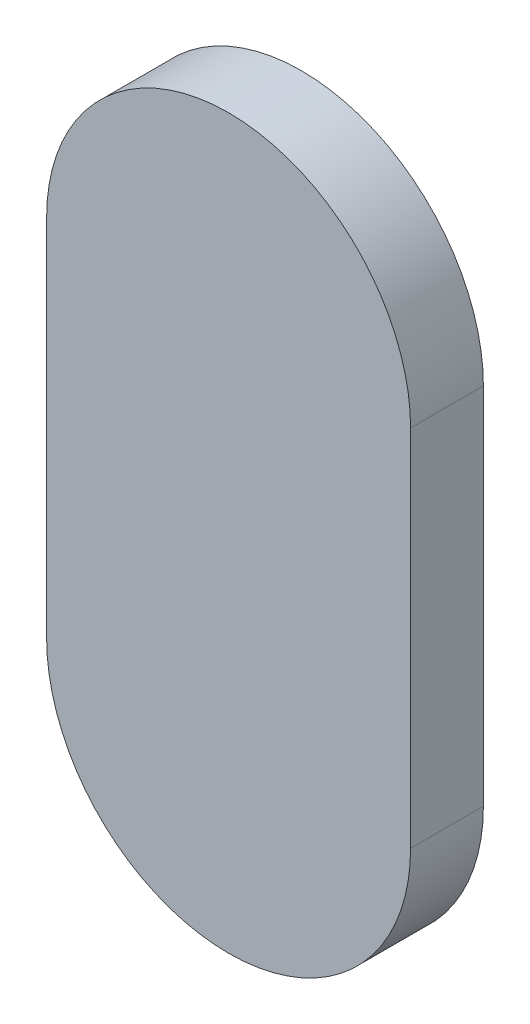
ISO-10303-21;
HEADER;
FILE_DESCRIPTION(('STEP AP214'),'2;1');
FILE_NAME('part.step','',(''),(''),'','','');
FILE_SCHEMA(('AUTOMOTIVE_DESIGN { 1 0 10303 214 1 1 1 1 }'));
ENDSEC;
DATA;
#1=APPLICATION_CONTEXT('core data for automotive mechanical design processes');
#2=APPLICATION_PROTOCOL_DEFINITION('international standard','automotive_design',2000,#1);
#3=PRODUCT_CONTEXT('',#1,'mechanical');
#4=PRODUCT('Part','Part','',(#3));
#5=PRODUCT_RELATED_PRODUCT_CATEGORY('part','',(#4));
#6=PRODUCT_DEFINITION_FORMATION('','',#4);
#7=PRODUCT_DEFINITION_CONTEXT('part definition',#1,'design');
#8=PRODUCT_DEFINITION('design','',#6,#7);
#9=PRODUCT_DEFINITION_SHAPE('','',#8);
#10=(LENGTH_UNIT() NAMED_UNIT(*) SI_UNIT(.MILLI.,.METRE.));
#11=(NAMED_UNIT(*) PLANE_ANGLE_UNIT() SI_UNIT($,.RADIAN.));
#12=(NAMED_UNIT(*) SI_UNIT($,.STERADIAN.) SOLID_ANGLE_UNIT());
#13=UNCERTAINTY_MEASURE_WITH_UNIT(LENGTH_MEASURE(1.E-05),#10,'distance_accuracy_value','');
#14=(GEOMETRIC_REPRESENTATION_CONTEXT(3) GLOBAL_UNCERTAINTY_ASSIGNED_CONTEXT((#13)) GLOBAL_UNIT_ASSIGNED_CONTEXT((#10,
#11,#12)) REPRESENTATION_CONTEXT('',''));
#15=CARTESIAN_POINT('',(0.,0.,0.));
#16=DIRECTION('',(0.,0.,1.));
#17=DIRECTION('',(1.,0.,0.));
#18=AXIS2_PLACEMENT_3D('',#15,#16,#17);
#19=CARTESIAN_POINT('',(0.,25.,10.));
#20=DIRECTION('',(0.,0.,-1.));
#21=DIRECTION('',(-1.,0.,0.));
#22=AXIS2_PLACEMENT_3D('',#19,#20,#21);
#23=CYLINDRICAL_SURFACE('',#22,25.);
#24=CARTESIAN_POINT('',(0.,25.,0.));
#25=DIRECTION('',(0.,0.,1.));
#26=DIRECTION('',(1.,0.,0.));
#27=AXIS2_PLACEMENT_3D('',#24,#25,#26);
#28=CIRCLE('',#27,25.);
#29=CARTESIAN_POINT('',(25.,25.,0.));
#30=VERTEX_POINT('',#29);
#31=CARTESIAN_POINT('',(-25.,25.,0.));
#32=VERTEX_POINT('',#31);
#33=EDGE_CURVE('E105',#30,#32,#28,.T.);
#34=ORIENTED_EDGE('',*,*,#33,.T.);
#35=DIRECTION('',(0.,0.,-1.));
#36=VECTOR('',#35,1.);
#37=CARTESIAN_POINT('',(-25.,25.,10.));
#38=LINE('',#37,#36);
#39=CARTESIAN_POINT('',(-25.,25.,10.));
#40=VERTEX_POINT('',#39);
#41=EDGE_CURVE('E11',#40,#32,#38,.T.);
#42=ORIENTED_EDGE('',*,*,#41,.F.);
#43=CARTESIAN_POINT('',(0.,25.,10.));
#44=DIRECTION('',(0.,0.,1.));
#45=DIRECTION('',(1.,0.,0.));
#46=AXIS2_PLACEMENT_3D('',#43,#44,#45);
#47=CIRCLE('',#46,25.);
#48=CARTESIAN_POINT('',(25.,25.,10.));
#49=VERTEX_POINT('',#48);
#50=EDGE_CURVE('E93',#49,#40,#47,.T.);
#51=ORIENTED_EDGE('',*,*,#50,.F.);
#52=DIRECTION('',(0.,0.,-1.));
#53=VECTOR('',#52,1.);
#54=CARTESIAN_POINT('',(25.,25.,10.));
#55=LINE('',#54,#53);
#56=EDGE_CURVE('E101',#49,#30,#55,.T.);
#57=ORIENTED_EDGE('',*,*,#56,.T.);
#58=EDGE_LOOP('',(#34,#42,#51,#57));
#59=FACE_BOUND('',#58,.T.);
#60=ADVANCED_FACE('F42',(#59),#23,.T.);
#61=CARTESIAN_POINT('',(-25.,25.,10.));
#62=DIRECTION('',(1.,0.,0.));
#63=DIRECTION('',(0.,1.,0.));
#64=AXIS2_PLACEMENT_3D('',#61,#62,#63);
#65=PLANE('',#64);
#66=DIRECTION('',(0.,-1.,0.));
#67=VECTOR('',#66,1.);
#68=CARTESIAN_POINT('',(-25.,25.,0.));
#69=LINE('',#68,#67);
#70=CARTESIAN_POINT('',(-25.,-25.,0.));
#71=VERTEX_POINT('',#70);
#72=EDGE_CURVE('E97',#32,#71,#69,.T.);
#73=ORIENTED_EDGE('',*,*,#72,.T.);
#74=DIRECTION('',(0.,0.,-1.));
#75=VECTOR('',#74,1.);
#76=CARTESIAN_POINT('',(-25.,-25.,10.));
#77=LINE('',#76,#75);
#78=CARTESIAN_POINT('',(-25.,-25.,10.));
#79=VERTEX_POINT('',#78);
#80=EDGE_CURVE('E50',#79,#71,#77,.T.);
#81=ORIENTED_EDGE('',*,*,#80,.F.);
#82=DIRECTION('',(0.,-1.,0.));
#83=VECTOR('',#82,1.);
#84=CARTESIAN_POINT('',(-25.,25.,10.));
#85=LINE('',#84,#83);
#86=EDGE_CURVE('E88',#40,#79,#85,.T.);
#87=ORIENTED_EDGE('',*,*,#86,.F.);
#88=ORIENTED_EDGE('',*,*,#41,.T.);
#89=EDGE_LOOP('',(#73,#81,#87,#88));
#90=FACE_BOUND('',#89,.T.);
#91=ADVANCED_FACE('F96',(#90),#65,.F.);
#92=CARTESIAN_POINT('',(0.,-25.,10.));
#93=DIRECTION('',(0.,0.,-1.));
#94=DIRECTION('',(-1.,0.,0.));
#95=AXIS2_PLACEMENT_3D('',#92,#93,#94);
#96=CYLINDRICAL_SURFACE('',#95,25.);
#97=CARTESIAN_POINT('',(0.,-25.,0.));
#98=DIRECTION('',(0.,0.,1.));
#99=DIRECTION('',(1.,0.,0.));
#100=AXIS2_PLACEMENT_3D('',#97,#98,#99);
#101=CIRCLE('',#100,25.);
#102=CARTESIAN_POINT('',(25.,-25.,0.));
#103=VERTEX_POINT('',#102);
#104=EDGE_CURVE('E75',#71,#103,#101,.T.);
#105=ORIENTED_EDGE('',*,*,#104,.T.);
#106=DIRECTION('',(0.,0.,-1.));
#107=VECTOR('',#106,1.);
#108=CARTESIAN_POINT('',(25.,-25.,10.));
#109=LINE('',#108,#107);
#110=CARTESIAN_POINT('',(25.,-25.,10.));
#111=VERTEX_POINT('',#110);
#112=EDGE_CURVE('E98',#111,#103,#109,.T.);
#113=ORIENTED_EDGE('',*,*,#112,.F.);
#114=CARTESIAN_POINT('',(0.,-25.,10.));
#115=DIRECTION('',(0.,0.,1.));
#116=DIRECTION('',(1.,0.,0.));
#117=AXIS2_PLACEMENT_3D('',#114,#115,#116);
#118=CIRCLE('',#117,25.);
#119=EDGE_CURVE('E91',#79,#111,#118,.T.);
#120=ORIENTED_EDGE('',*,*,#119,.F.);
#121=ORIENTED_EDGE('',*,*,#80,.T.);
#122=EDGE_LOOP('',(#105,#113,#120,#121));
#123=FACE_BOUND('',#122,.T.);
#124=ADVANCED_FACE('F99',(#123),#96,.T.);
#125=CARTESIAN_POINT('',(25.,25.,10.));
#126=DIRECTION('',(-1.,0.,0.));
#127=DIRECTION('',(0.,-1.,0.));
#128=AXIS2_PLACEMENT_3D('',#125,#126,#127);
#129=PLANE('',#128);
#130=DIRECTION('',(0.,1.,0.));
#131=VECTOR('',#130,1.);
#132=CARTESIAN_POINT('',(25.,25.,0.));
#133=LINE('',#132,#131);
#134=EDGE_CURVE('E81',#103,#30,#133,.T.);
#135=ORIENTED_EDGE('',*,*,#134,.T.);
#136=ORIENTED_EDGE('',*,*,#56,.F.);
#137=DIRECTION('',(0.,1.,0.));
#138=VECTOR('',#137,1.);
#139=CARTESIAN_POINT('',(25.,25.,10.));
#140=LINE('',#139,#138);
#141=EDGE_CURVE('E58',#111,#49,#140,.T.);
#142=ORIENTED_EDGE('',*,*,#141,.F.);
#143=ORIENTED_EDGE('',*,*,#112,.T.);
#144=EDGE_LOOP('',(#135,#136,#142,#143));
#145=FACE_BOUND('',#144,.T.);
#146=ADVANCED_FACE('F112',(#145),#129,.F.);
#147=CARTESIAN_POINT('',(0.,25.,10.));
#148=DIRECTION('',(0.,0.,1.));
#149=DIRECTION('',(1.,0.,0.));
#150=AXIS2_PLACEMENT_3D('',#147,#148,#149);
#151=PLANE('',#150);
#152=ORIENTED_EDGE('',*,*,#50,.T.);
#153=ORIENTED_EDGE('',*,*,#86,.T.);
#154=ORIENTED_EDGE('',*,*,#119,.T.);
#155=ORIENTED_EDGE('',*,*,#141,.T.);
#156=EDGE_LOOP('',(#152,#153,#154,#155));
#157=FACE_BOUND('',#156,.T.);
#158=ADVANCED_FACE('F89',(#157),#151,.T.);
#159=CARTESIAN_POINT('',(0.,25.,0.));
#160=DIRECTION('',(0.,0.,1.));
#161=DIRECTION('',(1.,0.,0.));
#162=AXIS2_PLACEMENT_3D('',#159,#160,#161);
#163=PLANE('',#162);
#164=ORIENTED_EDGE('',*,*,#33,.F.);
#165=ORIENTED_EDGE('',*,*,#134,.F.);
#166=ORIENTED_EDGE('',*,*,#104,.F.);
#167=ORIENTED_EDGE('',*,*,#72,.F.);
#168=EDGE_LOOP('',(#164,#165,#166,#167));
#169=FACE_BOUND('',#168,.T.);
#170=ADVANCED_FACE('F115',(#169),#163,.F.);
#171=CLOSED_SHELL('',(#60,#91,#124,#146,#158,#170));
#172=MANIFOLD_SOLID_BREP('B2',#171);
#173=ADVANCED_BREP_SHAPE_REPRESENTATION('',(#18,#172),#14);
#174=SHAPE_DEFINITION_REPRESENTATION(#9,#173);
ENDSEC;
END-ISO-10303-21;
